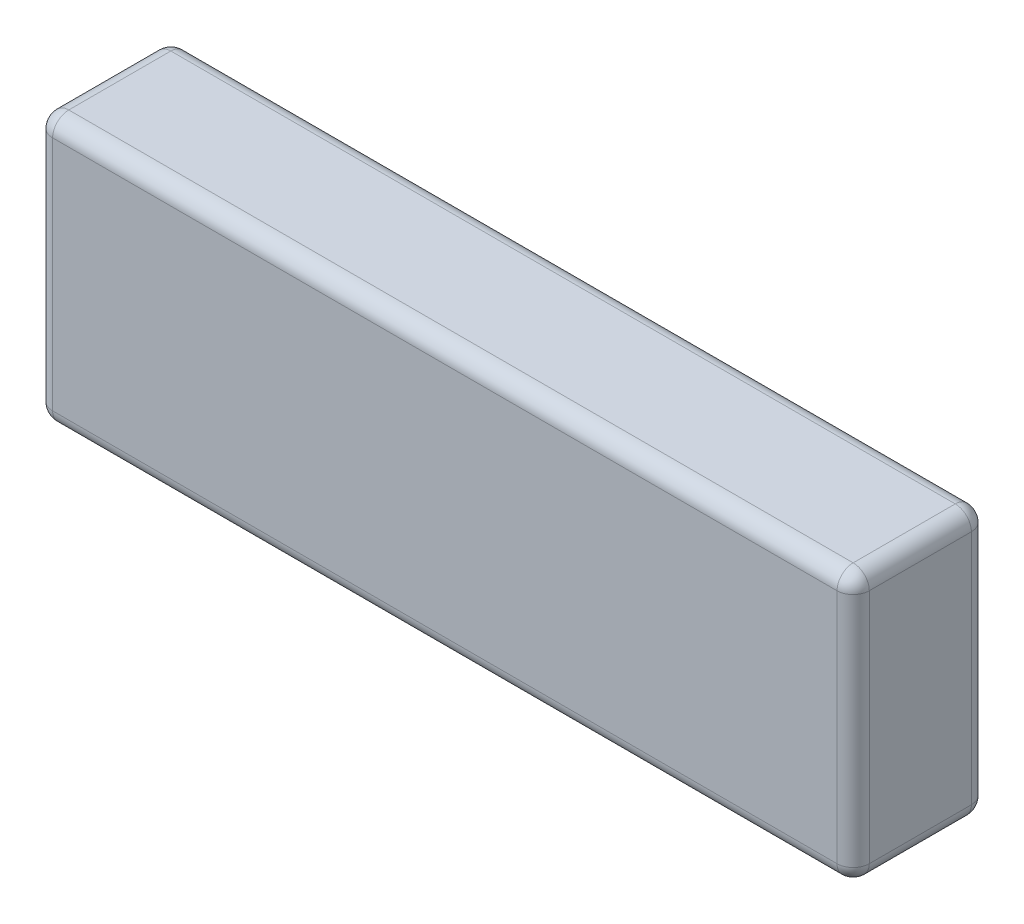
ISO-10303-21;
HEADER;
FILE_DESCRIPTION(('STEP AP214'),'2;1');
FILE_NAME('part.step','',(''),(''),'','','');
FILE_SCHEMA(('AUTOMOTIVE_DESIGN { 1 0 10303 214 1 1 1 1 }'));
ENDSEC;
DATA;
#1=APPLICATION_CONTEXT('core data for automotive mechanical design processes');
#2=APPLICATION_PROTOCOL_DEFINITION('international standard','automotive_design',2000,#1);
#3=PRODUCT_CONTEXT('',#1,'mechanical');
#4=PRODUCT('Part','Part','',(#3));
#5=PRODUCT_RELATED_PRODUCT_CATEGORY('part','',(#4));
#6=PRODUCT_DEFINITION_FORMATION('','',#4);
#7=PRODUCT_DEFINITION_CONTEXT('part definition',#1,'design');
#8=PRODUCT_DEFINITION('design','',#6,#7);
#9=PRODUCT_DEFINITION_SHAPE('','',#8);
#10=(LENGTH_UNIT() NAMED_UNIT(*) SI_UNIT(.MILLI.,.METRE.));
#11=(NAMED_UNIT(*) PLANE_ANGLE_UNIT() SI_UNIT($,.RADIAN.));
#12=(NAMED_UNIT(*) SI_UNIT($,.STERADIAN.) SOLID_ANGLE_UNIT());
#13=UNCERTAINTY_MEASURE_WITH_UNIT(LENGTH_MEASURE(1.E-05),#10,'distance_accuracy_value','');
#14=(GEOMETRIC_REPRESENTATION_CONTEXT(3) GLOBAL_UNCERTAINTY_ASSIGNED_CONTEXT((#13)) GLOBAL_UNIT_ASSIGNED_CONTEXT((#10,
#11,#12)) REPRESENTATION_CONTEXT('',''));
#15=CARTESIAN_POINT('',(0.,0.,0.));
#16=DIRECTION('',(0.,0.,1.));
#17=DIRECTION('',(1.,0.,0.));
#18=AXIS2_PLACEMENT_3D('',#15,#16,#17);
#19=CARTESIAN_POINT('',(76.,50.,-12.5));
#20=DIRECTION('',(-1.,0.,0.));
#21=DIRECTION('',(0.,0.,1.));
#22=AXIS2_PLACEMENT_3D('',#19,#20,#21);
#23=PLANE('',#22);
#24=DIRECTION('',(0.,-1.,0.));
#25=VECTOR('',#24,1.);
#26=CARTESIAN_POINT('',(76.,50.,-9.5));
#27=LINE('',#26,#25);
#28=CARTESIAN_POINT('',(76.,3.,-9.5));
#29=VERTEX_POINT('',#28);
#30=CARTESIAN_POINT('',(76.,47.,-9.5));
#31=VERTEX_POINT('',#30);
#32=EDGE_CURVE('E192',#29,#31,#27,.F.);
#33=ORIENTED_EDGE('',*,*,#32,.T.);
#34=DIRECTION('',(0.,0.,-1.));
#35=VECTOR('',#34,1.);
#36=CARTESIAN_POINT('',(76.,47.,12.5));
#37=LINE('',#36,#35);
#38=CARTESIAN_POINT('',(76.,47.,9.5));
#39=VERTEX_POINT('',#38);
#40=EDGE_CURVE('E194',#31,#39,#37,.F.);
#41=ORIENTED_EDGE('',*,*,#40,.T.);
#42=DIRECTION('',(0.,-1.,0.));
#43=VECTOR('',#42,1.);
#44=CARTESIAN_POINT('',(76.,50.,9.5));
#45=LINE('',#44,#43);
#46=CARTESIAN_POINT('',(76.,3.,9.5));
#47=VERTEX_POINT('',#46);
#48=EDGE_CURVE('E188',#39,#47,#45,.T.);
#49=ORIENTED_EDGE('',*,*,#48,.T.);
#50=DIRECTION('',(0.,0.,-1.));
#51=VECTOR('',#50,1.);
#52=CARTESIAN_POINT('',(76.,3.,-12.5));
#53=LINE('',#52,#51);
#54=EDGE_CURVE('E190',#47,#29,#53,.T.);
#55=ORIENTED_EDGE('',*,*,#54,.T.);
#56=EDGE_LOOP('',(#33,#41,#49,#55));
#57=FACE_BOUND('',#56,.T.);
#58=ADVANCED_FACE('F36',(#57),#23,.F.);
#59=CARTESIAN_POINT('',(-76.,50.,-12.5));
#60=DIRECTION('',(0.,0.,1.));
#61=DIRECTION('',(1.,0.,0.));
#62=AXIS2_PLACEMENT_3D('',#59,#60,#61);
#63=PLANE('',#62);
#64=DIRECTION('',(0.,-1.,0.));
#65=VECTOR('',#64,1.);
#66=CARTESIAN_POINT('',(-73.,50.,-12.5));
#67=LINE('',#66,#65);
#68=CARTESIAN_POINT('',(-73.,3.,-12.5));
#69=VERTEX_POINT('',#68);
#70=CARTESIAN_POINT('',(-73.,47.,-12.5));
#71=VERTEX_POINT('',#70);
#72=EDGE_CURVE('E183',#69,#71,#67,.F.);
#73=ORIENTED_EDGE('',*,*,#72,.T.);
#74=DIRECTION('',(-1.,0.,0.));
#75=VECTOR('',#74,1.);
#76=CARTESIAN_POINT('',(76.,47.,-12.5));
#77=LINE('',#76,#75);
#78=CARTESIAN_POINT('',(73.,47.,-12.5));
#79=VERTEX_POINT('',#78);
#80=EDGE_CURVE('E185',#71,#79,#77,.F.);
#81=ORIENTED_EDGE('',*,*,#80,.T.);
#82=DIRECTION('',(0.,-1.,0.));
#83=VECTOR('',#82,1.);
#84=CARTESIAN_POINT('',(73.,50.,-12.5));
#85=LINE('',#84,#83);
#86=CARTESIAN_POINT('',(73.,3.,-12.5));
#87=VERTEX_POINT('',#86);
#88=EDGE_CURVE('E179',#79,#87,#85,.T.);
#89=ORIENTED_EDGE('',*,*,#88,.T.);
#90=DIRECTION('',(-1.,0.,0.));
#91=VECTOR('',#90,1.);
#92=CARTESIAN_POINT('',(-76.,3.,-12.5));
#93=LINE('',#92,#91);
#94=EDGE_CURVE('E181',#87,#69,#93,.T.);
#95=ORIENTED_EDGE('',*,*,#94,.T.);
#96=EDGE_LOOP('',(#73,#81,#89,#95));
#97=FACE_BOUND('',#96,.T.);
#98=ADVANCED_FACE('F272',(#97),#63,.F.);
#99=CARTESIAN_POINT('',(-76.,50.,-12.5));
#100=DIRECTION('',(1.,0.,0.));
#101=DIRECTION('',(0.,0.,-1.));
#102=AXIS2_PLACEMENT_3D('',#99,#100,#101);
#103=PLANE('',#102);
#104=DIRECTION('',(0.,0.,1.));
#105=VECTOR('',#104,1.);
#106=CARTESIAN_POINT('',(-76.,47.,-12.5));
#107=LINE('',#106,#105);
#108=CARTESIAN_POINT('',(-76.,47.,9.5));
#109=VERTEX_POINT('',#108);
#110=CARTESIAN_POINT('',(-76.,47.,-9.5));
#111=VERTEX_POINT('',#110);
#112=EDGE_CURVE('E132',#109,#111,#107,.F.);
#113=ORIENTED_EDGE('',*,*,#112,.T.);
#114=DIRECTION('',(0.,-1.,0.));
#115=VECTOR('',#114,1.);
#116=CARTESIAN_POINT('',(-76.,50.,-9.5));
#117=LINE('',#116,#115);
#118=CARTESIAN_POINT('',(-76.,3.,-9.5));
#119=VERTEX_POINT('',#118);
#120=EDGE_CURVE('E168',#111,#119,#117,.T.);
#121=ORIENTED_EDGE('',*,*,#120,.T.);
#122=DIRECTION('',(0.,0.,1.));
#123=VECTOR('',#122,1.);
#124=CARTESIAN_POINT('',(-76.,3.,-12.5));
#125=LINE('',#124,#123);
#126=CARTESIAN_POINT('',(-76.,3.,9.5));
#127=VERTEX_POINT('',#126);
#128=EDGE_CURVE('E161',#119,#127,#125,.T.);
#129=ORIENTED_EDGE('',*,*,#128,.T.);
#130=DIRECTION('',(0.,-1.,0.));
#131=VECTOR('',#130,1.);
#132=CARTESIAN_POINT('',(-76.,50.,9.5));
#133=LINE('',#132,#131);
#134=EDGE_CURVE('E159',#127,#109,#133,.F.);
#135=ORIENTED_EDGE('',*,*,#134,.T.);
#136=EDGE_LOOP('',(#113,#121,#129,#135));
#137=FACE_BOUND('',#136,.T.);
#138=ADVANCED_FACE('F333',(#137),#103,.F.);
#139=CARTESIAN_POINT('',(-76.,50.,12.5));
#140=DIRECTION('',(0.,0.,-1.));
#141=DIRECTION('',(-1.,0.,0.));
#142=AXIS2_PLACEMENT_3D('',#139,#140,#141);
#143=PLANE('',#142);
#144=DIRECTION('',(1.,0.,0.));
#145=VECTOR('',#144,1.);
#146=CARTESIAN_POINT('',(-76.,47.,12.5));
#147=LINE('',#146,#145);
#148=CARTESIAN_POINT('',(73.,47.,12.5));
#149=VERTEX_POINT('',#148);
#150=CARTESIAN_POINT('',(-73.,47.,12.5));
#151=VERTEX_POINT('',#150);
#152=EDGE_CURVE('E45',#149,#151,#147,.F.);
#153=ORIENTED_EDGE('',*,*,#152,.T.);
#154=DIRECTION('',(0.,-1.,0.));
#155=VECTOR('',#154,1.);
#156=CARTESIAN_POINT('',(-73.,50.,12.5));
#157=LINE('',#156,#155);
#158=CARTESIAN_POINT('',(-73.,3.,12.5));
#159=VERTEX_POINT('',#158);
#160=EDGE_CURVE('E11',#151,#159,#157,.T.);
#161=ORIENTED_EDGE('',*,*,#160,.T.);
#162=DIRECTION('',(1.,0.,0.));
#163=VECTOR('',#162,1.);
#164=CARTESIAN_POINT('',(-76.,3.,12.5));
#165=LINE('',#164,#163);
#166=CARTESIAN_POINT('',(73.,3.,12.5));
#167=VERTEX_POINT('',#166);
#168=EDGE_CURVE('E197',#159,#167,#165,.T.);
#169=ORIENTED_EDGE('',*,*,#168,.T.);
#170=DIRECTION('',(0.,-1.,0.));
#171=VECTOR('',#170,1.);
#172=CARTESIAN_POINT('',(73.,50.,12.5));
#173=LINE('',#172,#171);
#174=EDGE_CURVE('E56',#167,#149,#173,.F.);
#175=ORIENTED_EDGE('',*,*,#174,.T.);
#176=EDGE_LOOP('',(#153,#161,#169,#175));
#177=FACE_BOUND('',#176,.T.);
#178=ADVANCED_FACE('F360',(#177),#143,.F.);
#179=CARTESIAN_POINT('',(0.,50.,0.));
#180=DIRECTION('',(0.,1.,0.));
#181=DIRECTION('',(0.,0.,1.));
#182=AXIS2_PLACEMENT_3D('',#179,#180,#181);
#183=PLANE('',#182);
#184=DIRECTION('',(-1.,0.,0.));
#185=VECTOR('',#184,1.);
#186=CARTESIAN_POINT('',(-76.,50.,-9.5));
#187=LINE('',#186,#185);
#188=CARTESIAN_POINT('',(73.,50.,-9.5));
#189=VERTEX_POINT('',#188);
#190=CARTESIAN_POINT('',(-73.,50.,-9.5));
#191=VERTEX_POINT('',#190);
#192=EDGE_CURVE('E157',#189,#191,#187,.T.);
#193=ORIENTED_EDGE('',*,*,#192,.T.);
#194=DIRECTION('',(0.,0.,1.));
#195=VECTOR('',#194,1.);
#196=CARTESIAN_POINT('',(-73.,50.,12.5));
#197=LINE('',#196,#195);
#198=CARTESIAN_POINT('',(-73.,50.,9.5));
#199=VERTEX_POINT('',#198);
#200=EDGE_CURVE('E130',#191,#199,#197,.T.);
#201=ORIENTED_EDGE('',*,*,#200,.T.);
#202=DIRECTION('',(1.,0.,0.));
#203=VECTOR('',#202,1.);
#204=CARTESIAN_POINT('',(76.,50.,9.5));
#205=LINE('',#204,#203);
#206=CARTESIAN_POINT('',(73.,50.,9.5));
#207=VERTEX_POINT('',#206);
#208=EDGE_CURVE('E147',#199,#207,#205,.T.);
#209=ORIENTED_EDGE('',*,*,#208,.T.);
#210=DIRECTION('',(0.,0.,-1.));
#211=VECTOR('',#210,1.);
#212=CARTESIAN_POINT('',(73.,50.,-12.5));
#213=LINE('',#212,#211);
#214=EDGE_CURVE('E153',#207,#189,#213,.T.);
#215=ORIENTED_EDGE('',*,*,#214,.T.);
#216=EDGE_LOOP('',(#193,#201,#209,#215));
#217=FACE_BOUND('',#216,.T.);
#218=ADVANCED_FACE('F155',(#217),#183,.T.);
#219=CARTESIAN_POINT('',(0.,0.,0.));
#220=DIRECTION('',(0.,1.,0.));
#221=DIRECTION('',(0.,0.,1.));
#222=AXIS2_PLACEMENT_3D('',#219,#220,#221);
#223=PLANE('',#222);
#224=DIRECTION('',(1.,0.,0.));
#225=VECTOR('',#224,1.);
#226=CARTESIAN_POINT('',(0.,0.,9.5));
#227=LINE('',#226,#225);
#228=CARTESIAN_POINT('',(73.,0.,9.5));
#229=VERTEX_POINT('',#228);
#230=CARTESIAN_POINT('',(-73.,0.,9.5));
#231=VERTEX_POINT('',#230);
#232=EDGE_CURVE('E170',#229,#231,#227,.F.);
#233=ORIENTED_EDGE('',*,*,#232,.T.);
#234=DIRECTION('',(0.,0.,1.));
#235=VECTOR('',#234,1.);
#236=CARTESIAN_POINT('',(-73.,0.,0.));
#237=LINE('',#236,#235);
#238=CARTESIAN_POINT('',(-73.,0.,-9.5));
#239=VERTEX_POINT('',#238);
#240=EDGE_CURVE('E176',#231,#239,#237,.F.);
#241=ORIENTED_EDGE('',*,*,#240,.T.);
#242=DIRECTION('',(-1.,0.,0.));
#243=VECTOR('',#242,1.);
#244=CARTESIAN_POINT('',(0.,0.,-9.5));
#245=LINE('',#244,#243);
#246=CARTESIAN_POINT('',(73.,0.,-9.5));
#247=VERTEX_POINT('',#246);
#248=EDGE_CURVE('E174',#239,#247,#245,.F.);
#249=ORIENTED_EDGE('',*,*,#248,.T.);
#250=DIRECTION('',(0.,0.,-1.));
#251=VECTOR('',#250,1.);
#252=CARTESIAN_POINT('',(73.,0.,0.));
#253=LINE('',#252,#251);
#254=EDGE_CURVE('E172',#247,#229,#253,.F.);
#255=ORIENTED_EDGE('',*,*,#254,.T.);
#256=EDGE_LOOP('',(#233,#241,#249,#255));
#257=FACE_BOUND('',#256,.T.);
#258=ADVANCED_FACE('F298',(#257),#223,.F.);
#259=CARTESIAN_POINT('',(73.,3.,-12.5));
#260=DIRECTION('',(0.,0.,-1.));
#261=DIRECTION('',(-1.,0.,0.));
#262=AXIS2_PLACEMENT_3D('',#259,#260,#261);
#263=CYLINDRICAL_SURFACE('',#262,3.);
#264=CARTESIAN_POINT('',(73.,3.,-9.5));
#265=DIRECTION('',(0.,0.,-1.));
#266=DIRECTION('',(-1.,0.,0.));
#267=AXIS2_PLACEMENT_3D('',#264,#265,#266);
#268=CIRCLE('',#267,3.);
#269=EDGE_CURVE('E40',#29,#247,#268,.T.);
#270=ORIENTED_EDGE('',*,*,#269,.F.);
#271=ORIENTED_EDGE('',*,*,#54,.F.);
#272=CARTESIAN_POINT('',(73.,3.,9.5));
#273=DIRECTION('',(0.,0.,1.));
#274=DIRECTION('',(1.,0.,0.));
#275=AXIS2_PLACEMENT_3D('',#272,#273,#274);
#276=CIRCLE('',#275,3.);
#277=EDGE_CURVE('E249',#229,#47,#276,.T.);
#278=ORIENTED_EDGE('',*,*,#277,.F.);
#279=ORIENTED_EDGE('',*,*,#254,.F.);
#280=EDGE_LOOP('',(#270,#271,#278,#279));
#281=FACE_BOUND('',#280,.T.);
#282=ADVANCED_FACE('F38',(#281),#263,.T.);
#283=CARTESIAN_POINT('',(73.,3.,-9.5));
#284=DIRECTION('',(0.,0.,1.));
#285=DIRECTION('',(1.,0.,0.));
#286=AXIS2_PLACEMENT_3D('',#283,#284,#285);
#287=SPHERICAL_SURFACE('',#286,3.);
#288=CARTESIAN_POINT('',(73.,3.,-9.5));
#289=DIRECTION('',(0.,-1.,0.));
#290=DIRECTION('',(0.,0.,-1.));
#291=AXIS2_PLACEMENT_3D('',#288,#289,#290);
#292=CIRCLE('',#291,3.);
#293=EDGE_CURVE('E244',#29,#87,#292,.F.);
#294=ORIENTED_EDGE('',*,*,#293,.F.);
#295=ORIENTED_EDGE('',*,*,#269,.T.);
#296=CARTESIAN_POINT('',(73.,3.,-9.5));
#297=DIRECTION('',(1.,0.,0.));
#298=DIRECTION('',(0.,0.,-1.));
#299=AXIS2_PLACEMENT_3D('',#296,#297,#298);
#300=CIRCLE('',#299,3.);
#301=EDGE_CURVE('E247',#87,#247,#300,.F.);
#302=ORIENTED_EDGE('',*,*,#301,.F.);
#303=EDGE_LOOP('',(#294,#295,#302));
#304=FACE_BOUND('',#303,.T.);
#305=ADVANCED_FACE('F260',(#304),#287,.T.);
#306=CARTESIAN_POINT('',(73.,3.,9.5));
#307=DIRECTION('',(0.,0.,1.));
#308=DIRECTION('',(1.,0.,0.));
#309=AXIS2_PLACEMENT_3D('',#306,#307,#308);
#310=SPHERICAL_SURFACE('',#309,3.);
#311=CARTESIAN_POINT('',(73.,3.,9.5));
#312=DIRECTION('',(1.,0.,0.));
#313=DIRECTION('',(0.,0.,-1.));
#314=AXIS2_PLACEMENT_3D('',#311,#312,#313);
#315=CIRCLE('',#314,3.);
#316=EDGE_CURVE('E238',#229,#167,#315,.F.);
#317=ORIENTED_EDGE('',*,*,#316,.F.);
#318=ORIENTED_EDGE('',*,*,#277,.T.);
#319=CARTESIAN_POINT('',(73.,3.,9.5));
#320=DIRECTION('',(0.,-1.,0.));
#321=DIRECTION('',(0.,0.,-1.));
#322=AXIS2_PLACEMENT_3D('',#319,#320,#321);
#323=CIRCLE('',#322,3.);
#324=EDGE_CURVE('E241',#167,#47,#323,.F.);
#325=ORIENTED_EDGE('',*,*,#324,.F.);
#326=EDGE_LOOP('',(#317,#318,#325));
#327=FACE_BOUND('',#326,.T.);
#328=ADVANCED_FACE('F291',(#327),#310,.T.);
#329=CARTESIAN_POINT('',(-76.,3.,-9.5));
#330=DIRECTION('',(-1.,0.,0.));
#331=DIRECTION('',(0.,0.,1.));
#332=AXIS2_PLACEMENT_3D('',#329,#330,#331);
#333=CYLINDRICAL_SURFACE('',#332,3.);
#334=ORIENTED_EDGE('',*,*,#301,.T.);
#335=ORIENTED_EDGE('',*,*,#248,.F.);
#336=CARTESIAN_POINT('',(-73.,3.,-9.5));
#337=DIRECTION('',(-1.,0.,0.));
#338=DIRECTION('',(0.,0.,1.));
#339=AXIS2_PLACEMENT_3D('',#336,#337,#338);
#340=CIRCLE('',#339,3.);
#341=EDGE_CURVE('E233',#69,#239,#340,.T.);
#342=ORIENTED_EDGE('',*,*,#341,.F.);
#343=ORIENTED_EDGE('',*,*,#94,.F.);
#344=EDGE_LOOP('',(#334,#335,#342,#343));
#345=FACE_BOUND('',#344,.T.);
#346=ADVANCED_FACE('F268',(#345),#333,.T.);
#347=CARTESIAN_POINT('',(73.,50.,-9.5));
#348=DIRECTION('',(0.,-1.,0.));
#349=DIRECTION('',(0.,0.,-1.));
#350=AXIS2_PLACEMENT_3D('',#347,#348,#349);
#351=CYLINDRICAL_SURFACE('',#350,3.);
#352=ORIENTED_EDGE('',*,*,#293,.T.);
#353=ORIENTED_EDGE('',*,*,#88,.F.);
#354=CARTESIAN_POINT('',(73.,47.,-9.5));
#355=DIRECTION('',(0.,1.,0.));
#356=DIRECTION('',(0.,0.,1.));
#357=AXIS2_PLACEMENT_3D('',#354,#355,#356);
#358=CIRCLE('',#357,3.);
#359=EDGE_CURVE('E230',#31,#79,#358,.T.);
#360=ORIENTED_EDGE('',*,*,#359,.F.);
#361=ORIENTED_EDGE('',*,*,#32,.F.);
#362=EDGE_LOOP('',(#352,#353,#360,#361));
#363=FACE_BOUND('',#362,.T.);
#364=ADVANCED_FACE('F278',(#363),#351,.T.);
#365=CARTESIAN_POINT('',(73.,47.,0.));
#366=DIRECTION('',(0.,0.,1.));
#367=DIRECTION('',(1.,0.,0.));
#368=AXIS2_PLACEMENT_3D('',#365,#366,#367);
#369=CYLINDRICAL_SURFACE('',#368,3.);
#370=CARTESIAN_POINT('',(73.,47.,9.5));
#371=DIRECTION('',(0.,0.,1.));
#372=DIRECTION('',(1.,0.,0.));
#373=AXIS2_PLACEMENT_3D('',#370,#371,#372);
#374=CIRCLE('',#373,3.);
#375=EDGE_CURVE('E224',#39,#207,#374,.T.);
#376=ORIENTED_EDGE('',*,*,#375,.F.);
#377=ORIENTED_EDGE('',*,*,#40,.F.);
#378=CARTESIAN_POINT('',(73.,47.,-9.5));
#379=DIRECTION('',(0.,0.,-1.));
#380=DIRECTION('',(-1.,0.,0.));
#381=AXIS2_PLACEMENT_3D('',#378,#379,#380);
#382=CIRCLE('',#381,3.);
#383=EDGE_CURVE('E227',#189,#31,#382,.T.);
#384=ORIENTED_EDGE('',*,*,#383,.F.);
#385=ORIENTED_EDGE('',*,*,#214,.F.);
#386=EDGE_LOOP('',(#376,#377,#384,#385));
#387=FACE_BOUND('',#386,.T.);
#388=ADVANCED_FACE('F284',(#387),#369,.T.);
#389=CARTESIAN_POINT('',(73.,50.,9.5));
#390=DIRECTION('',(0.,-1.,0.));
#391=DIRECTION('',(0.,0.,-1.));
#392=AXIS2_PLACEMENT_3D('',#389,#390,#391);
#393=CYLINDRICAL_SURFACE('',#392,3.);
#394=ORIENTED_EDGE('',*,*,#324,.T.);
#395=ORIENTED_EDGE('',*,*,#48,.F.);
#396=CARTESIAN_POINT('',(73.,47.,9.5));
#397=DIRECTION('',(0.,1.,0.));
#398=DIRECTION('',(0.,0.,1.));
#399=AXIS2_PLACEMENT_3D('',#396,#397,#398);
#400=CIRCLE('',#399,3.);
#401=EDGE_CURVE('E222',#149,#39,#400,.T.);
#402=ORIENTED_EDGE('',*,*,#401,.F.);
#403=ORIENTED_EDGE('',*,*,#174,.F.);
#404=EDGE_LOOP('',(#394,#395,#402,#403));
#405=FACE_BOUND('',#404,.T.);
#406=ADVANCED_FACE('F289',(#405),#393,.T.);
#407=CARTESIAN_POINT('',(-76.,3.,9.5));
#408=DIRECTION('',(1.,0.,0.));
#409=DIRECTION('',(0.,0.,-1.));
#410=AXIS2_PLACEMENT_3D('',#407,#408,#409);
#411=CYLINDRICAL_SURFACE('',#410,3.);
#412=ORIENTED_EDGE('',*,*,#316,.T.);
#413=ORIENTED_EDGE('',*,*,#168,.F.);
#414=CARTESIAN_POINT('',(-73.,3.,9.5));
#415=DIRECTION('',(-1.,0.,0.));
#416=DIRECTION('',(0.,0.,1.));
#417=AXIS2_PLACEMENT_3D('',#414,#415,#416);
#418=CIRCLE('',#417,3.);
#419=EDGE_CURVE('E219',#231,#159,#418,.T.);
#420=ORIENTED_EDGE('',*,*,#419,.F.);
#421=ORIENTED_EDGE('',*,*,#232,.F.);
#422=EDGE_LOOP('',(#412,#413,#420,#421));
#423=FACE_BOUND('',#422,.T.);
#424=ADVANCED_FACE('F295',(#423),#411,.T.);
#425=CARTESIAN_POINT('',(-73.,3.,-12.5));
#426=DIRECTION('',(0.,0.,1.));
#427=DIRECTION('',(1.,0.,0.));
#428=AXIS2_PLACEMENT_3D('',#425,#426,#427);
#429=CYLINDRICAL_SURFACE('',#428,3.);
#430=CARTESIAN_POINT('',(-73.,3.,-9.5));
#431=DIRECTION('',(0.,0.,-1.));
#432=DIRECTION('',(-1.,0.,0.));
#433=AXIS2_PLACEMENT_3D('',#430,#431,#432);
#434=CIRCLE('',#433,3.);
#435=EDGE_CURVE('E235',#239,#119,#434,.T.);
#436=ORIENTED_EDGE('',*,*,#435,.F.);
#437=ORIENTED_EDGE('',*,*,#240,.F.);
#438=CARTESIAN_POINT('',(-73.,3.,9.5));
#439=DIRECTION('',(0.,0.,1.));
#440=DIRECTION('',(1.,0.,0.));
#441=AXIS2_PLACEMENT_3D('',#438,#439,#440);
#442=CIRCLE('',#441,3.);
#443=EDGE_CURVE('E216',#127,#231,#442,.T.);
#444=ORIENTED_EDGE('',*,*,#443,.F.);
#445=ORIENTED_EDGE('',*,*,#128,.F.);
#446=EDGE_LOOP('',(#436,#437,#444,#445));
#447=FACE_BOUND('',#446,.T.);
#448=ADVANCED_FACE('F302',(#447),#429,.T.);
#449=CARTESIAN_POINT('',(-73.,3.,-9.5));
#450=DIRECTION('',(0.,0.,1.));
#451=DIRECTION('',(1.,0.,0.));
#452=AXIS2_PLACEMENT_3D('',#449,#450,#451);
#453=SPHERICAL_SURFACE('',#452,3.);
#454=ORIENTED_EDGE('',*,*,#341,.T.);
#455=ORIENTED_EDGE('',*,*,#435,.T.);
#456=CARTESIAN_POINT('',(-73.,3.,-9.5));
#457=DIRECTION('',(0.,-1.,0.));
#458=DIRECTION('',(0.,0.,-1.));
#459=AXIS2_PLACEMENT_3D('',#456,#457,#458);
#460=CIRCLE('',#459,3.);
#461=EDGE_CURVE('E213',#69,#119,#460,.F.);
#462=ORIENTED_EDGE('',*,*,#461,.F.);
#463=EDGE_LOOP('',(#454,#455,#462));
#464=FACE_BOUND('',#463,.T.);
#465=ADVANCED_FACE('F306',(#464),#453,.T.);
#466=CARTESIAN_POINT('',(73.,47.,-9.5));
#467=DIRECTION('',(0.,0.,1.));
#468=DIRECTION('',(1.,0.,0.));
#469=AXIS2_PLACEMENT_3D('',#466,#467,#468);
#470=SPHERICAL_SURFACE('',#469,3.);
#471=ORIENTED_EDGE('',*,*,#383,.T.);
#472=ORIENTED_EDGE('',*,*,#359,.T.);
#473=CARTESIAN_POINT('',(73.,47.,-9.5));
#474=DIRECTION('',(1.,0.,0.));
#475=DIRECTION('',(0.,1.,0.));
#476=AXIS2_PLACEMENT_3D('',#473,#474,#475);
#477=CIRCLE('',#476,3.);
#478=EDGE_CURVE('E211',#189,#79,#477,.F.);
#479=ORIENTED_EDGE('',*,*,#478,.F.);
#480=EDGE_LOOP('',(#471,#472,#479));
#481=FACE_BOUND('',#480,.T.);
#482=ADVANCED_FACE('F317',(#481),#470,.T.);
#483=CARTESIAN_POINT('',(73.,47.,9.5));
#484=DIRECTION('',(0.,0.,1.));
#485=DIRECTION('',(1.,0.,0.));
#486=AXIS2_PLACEMENT_3D('',#483,#484,#485);
#487=SPHERICAL_SURFACE('',#486,3.);
#488=ORIENTED_EDGE('',*,*,#401,.T.);
#489=ORIENTED_EDGE('',*,*,#375,.T.);
#490=CARTESIAN_POINT('',(73.,47.,9.5));
#491=DIRECTION('',(1.,0.,0.));
#492=DIRECTION('',(0.,0.,-1.));
#493=AXIS2_PLACEMENT_3D('',#490,#491,#492);
#494=CIRCLE('',#493,3.);
#495=EDGE_CURVE('E150',#149,#207,#494,.F.);
#496=ORIENTED_EDGE('',*,*,#495,.F.);
#497=EDGE_LOOP('',(#488,#489,#496));
#498=FACE_BOUND('',#497,.T.);
#499=ADVANCED_FACE('F319',(#498),#487,.T.);
#500=CARTESIAN_POINT('',(-73.,3.,9.5));
#501=DIRECTION('',(0.,0.,1.));
#502=DIRECTION('',(1.,0.,0.));
#503=AXIS2_PLACEMENT_3D('',#500,#501,#502);
#504=SPHERICAL_SURFACE('',#503,3.);
#505=ORIENTED_EDGE('',*,*,#443,.T.);
#506=ORIENTED_EDGE('',*,*,#419,.T.);
#507=CARTESIAN_POINT('',(-73.,3.,9.5));
#508=DIRECTION('',(0.,-1.,0.));
#509=DIRECTION('',(0.,0.,-1.));
#510=AXIS2_PLACEMENT_3D('',#507,#508,#509);
#511=CIRCLE('',#510,3.);
#512=EDGE_CURVE('E208',#127,#159,#511,.F.);
#513=ORIENTED_EDGE('',*,*,#512,.F.);
#514=EDGE_LOOP('',(#505,#506,#513));
#515=FACE_BOUND('',#514,.T.);
#516=ADVANCED_FACE('F325',(#515),#504,.T.);
#517=CARTESIAN_POINT('',(-73.,50.,-9.5));
#518=DIRECTION('',(0.,-1.,0.));
#519=DIRECTION('',(0.,0.,-1.));
#520=AXIS2_PLACEMENT_3D('',#517,#518,#519);
#521=CYLINDRICAL_SURFACE('',#520,3.);
#522=ORIENTED_EDGE('',*,*,#461,.T.);
#523=ORIENTED_EDGE('',*,*,#120,.F.);
#524=CARTESIAN_POINT('',(-73.,47.,-9.5));
#525=DIRECTION('',(0.,1.,0.));
#526=DIRECTION('',(0.,0.,1.));
#527=AXIS2_PLACEMENT_3D('',#524,#525,#526);
#528=CIRCLE('',#527,3.);
#529=EDGE_CURVE('E205',#71,#111,#528,.T.);
#530=ORIENTED_EDGE('',*,*,#529,.F.);
#531=ORIENTED_EDGE('',*,*,#72,.F.);
#532=EDGE_LOOP('',(#522,#523,#530,#531));
#533=FACE_BOUND('',#532,.T.);
#534=ADVANCED_FACE('F309',(#533),#521,.T.);
#535=CARTESIAN_POINT('',(0.,47.,-9.5));
#536=DIRECTION('',(1.,0.,0.));
#537=DIRECTION('',(0.,0.,-1.));
#538=AXIS2_PLACEMENT_3D('',#535,#536,#537);
#539=CYLINDRICAL_SURFACE('',#538,3.);
#540=ORIENTED_EDGE('',*,*,#478,.T.);
#541=ORIENTED_EDGE('',*,*,#80,.F.);
#542=CARTESIAN_POINT('',(-73.,47.,-9.5));
#543=DIRECTION('',(-1.,0.,0.));
#544=DIRECTION('',(0.,0.,1.));
#545=AXIS2_PLACEMENT_3D('',#542,#543,#544);
#546=CIRCLE('',#545,3.);
#547=EDGE_CURVE('E144',#191,#71,#546,.T.);
#548=ORIENTED_EDGE('',*,*,#547,.F.);
#549=ORIENTED_EDGE('',*,*,#192,.F.);
#550=EDGE_LOOP('',(#540,#541,#548,#549));
#551=FACE_BOUND('',#550,.T.);
#552=ADVANCED_FACE('F315',(#551),#539,.T.);
#553=CARTESIAN_POINT('',(0.,47.,9.5));
#554=DIRECTION('',(-1.,0.,0.));
#555=DIRECTION('',(0.,0.,1.));
#556=AXIS2_PLACEMENT_3D('',#553,#554,#555);
#557=CYLINDRICAL_SURFACE('',#556,3.);
#558=ORIENTED_EDGE('',*,*,#495,.T.);
#559=ORIENTED_EDGE('',*,*,#208,.F.);
#560=CARTESIAN_POINT('',(-73.,47.,9.5));
#561=DIRECTION('',(-1.,0.,0.));
#562=DIRECTION('',(0.,0.,1.));
#563=AXIS2_PLACEMENT_3D('',#560,#561,#562);
#564=CIRCLE('',#563,3.);
#565=EDGE_CURVE('E138',#151,#199,#564,.T.);
#566=ORIENTED_EDGE('',*,*,#565,.F.);
#567=ORIENTED_EDGE('',*,*,#152,.F.);
#568=EDGE_LOOP('',(#558,#559,#566,#567));
#569=FACE_BOUND('',#568,.T.);
#570=ADVANCED_FACE('F148',(#569),#557,.T.);
#571=CARTESIAN_POINT('',(-73.,50.,9.5));
#572=DIRECTION('',(0.,-1.,0.));
#573=DIRECTION('',(0.,0.,-1.));
#574=AXIS2_PLACEMENT_3D('',#571,#572,#573);
#575=CYLINDRICAL_SURFACE('',#574,3.);
#576=ORIENTED_EDGE('',*,*,#512,.T.);
#577=ORIENTED_EDGE('',*,*,#160,.F.);
#578=CARTESIAN_POINT('',(-73.,47.,9.5));
#579=DIRECTION('',(0.,1.,0.));
#580=DIRECTION('',(0.,0.,1.));
#581=AXIS2_PLACEMENT_3D('',#578,#579,#580);
#582=CIRCLE('',#581,3.);
#583=EDGE_CURVE('E142',#109,#151,#582,.T.);
#584=ORIENTED_EDGE('',*,*,#583,.F.);
#585=ORIENTED_EDGE('',*,*,#134,.F.);
#586=EDGE_LOOP('',(#576,#577,#584,#585));
#587=FACE_BOUND('',#586,.T.);
#588=ADVANCED_FACE('F343',(#587),#575,.T.);
#589=CARTESIAN_POINT('',(-73.,47.,-9.5));
#590=DIRECTION('',(0.,0.,1.));
#591=DIRECTION('',(1.,0.,0.));
#592=AXIS2_PLACEMENT_3D('',#589,#590,#591);
#593=SPHERICAL_SURFACE('',#592,3.);
#594=ORIENTED_EDGE('',*,*,#547,.T.);
#595=ORIENTED_EDGE('',*,*,#529,.T.);
#596=CARTESIAN_POINT('',(-73.,47.,-9.5));
#597=DIRECTION('',(0.,0.,-1.));
#598=DIRECTION('',(-1.,0.,0.));
#599=AXIS2_PLACEMENT_3D('',#596,#597,#598);
#600=CIRCLE('',#599,3.);
#601=EDGE_CURVE('E135',#191,#111,#600,.F.);
#602=ORIENTED_EDGE('',*,*,#601,.F.);
#603=EDGE_LOOP('',(#594,#595,#602));
#604=FACE_BOUND('',#603,.T.);
#605=ADVANCED_FACE('F313',(#604),#593,.T.);
#606=CARTESIAN_POINT('',(-73.,47.,9.5));
#607=DIRECTION('',(0.,0.,1.));
#608=DIRECTION('',(1.,0.,0.));
#609=AXIS2_PLACEMENT_3D('',#606,#607,#608);
#610=SPHERICAL_SURFACE('',#609,3.);
#611=ORIENTED_EDGE('',*,*,#583,.T.);
#612=ORIENTED_EDGE('',*,*,#565,.T.);
#613=CARTESIAN_POINT('',(-73.,47.,9.5));
#614=DIRECTION('',(0.,0.,1.));
#615=DIRECTION('',(1.,0.,0.));
#616=AXIS2_PLACEMENT_3D('',#613,#614,#615);
#617=CIRCLE('',#616,3.);
#618=EDGE_CURVE('E126',#109,#199,#617,.F.);
#619=ORIENTED_EDGE('',*,*,#618,.F.);
#620=EDGE_LOOP('',(#611,#612,#619));
#621=FACE_BOUND('',#620,.T.);
#622=ADVANCED_FACE('F140',(#621),#610,.T.);
#623=CARTESIAN_POINT('',(-73.,47.,0.));
#624=DIRECTION('',(0.,0.,-1.));
#625=DIRECTION('',(-1.,0.,0.));
#626=AXIS2_PLACEMENT_3D('',#623,#624,#625);
#627=CYLINDRICAL_SURFACE('',#626,3.);
#628=ORIENTED_EDGE('',*,*,#601,.T.);
#629=ORIENTED_EDGE('',*,*,#112,.F.);
#630=ORIENTED_EDGE('',*,*,#618,.T.);
#631=ORIENTED_EDGE('',*,*,#200,.F.);
#632=EDGE_LOOP('',(#628,#629,#630,#631));
#633=FACE_BOUND('',#632,.T.);
#634=ADVANCED_FACE('F128',(#633),#627,.T.);
#635=CLOSED_SHELL('',(#58,#98,#138,#178,#218,#258,#282,#305,#328,#346,#364,#388,#406,#424,#448,
#465,#482,#499,#516,#534,#552,#570,#588,#605,#622,#634));
#636=MANIFOLD_SOLID_BREP('B2',#635);
#637=ADVANCED_BREP_SHAPE_REPRESENTATION('',(#18,#636),#14);
#638=SHAPE_DEFINITION_REPRESENTATION(#9,#637);
ENDSEC;
END-ISO-10303-21;
